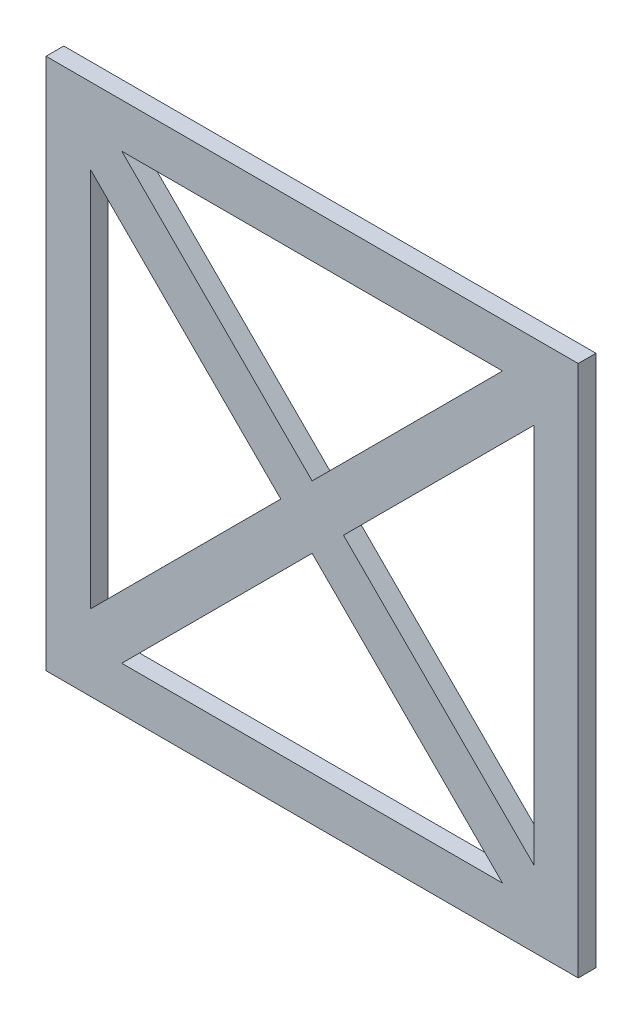
ISO-10303-21;
HEADER;
FILE_DESCRIPTION(('STEP AP214'),'2;1');
FILE_NAME('part.step','',(''),(''),'','','');
FILE_SCHEMA(('AUTOMOTIVE_DESIGN { 1 0 10303 214 1 1 1 1 }'));
ENDSEC;
DATA;
#1=APPLICATION_CONTEXT('core data for automotive mechanical design processes');
#2=APPLICATION_PROTOCOL_DEFINITION('international standard','automotive_design',2000,#1);
#3=PRODUCT_CONTEXT('',#1,'mechanical');
#4=PRODUCT('Part','Part','',(#3));
#5=PRODUCT_RELATED_PRODUCT_CATEGORY('part','',(#4));
#6=PRODUCT_DEFINITION_FORMATION('','',#4);
#7=PRODUCT_DEFINITION_CONTEXT('part definition',#1,'design');
#8=PRODUCT_DEFINITION('design','',#6,#7);
#9=PRODUCT_DEFINITION_SHAPE('','',#8);
#10=(LENGTH_UNIT() NAMED_UNIT(*) SI_UNIT(.MILLI.,.METRE.));
#11=(NAMED_UNIT(*) PLANE_ANGLE_UNIT() SI_UNIT($,.RADIAN.));
#12=(NAMED_UNIT(*) SI_UNIT($,.STERADIAN.) SOLID_ANGLE_UNIT());
#13=UNCERTAINTY_MEASURE_WITH_UNIT(LENGTH_MEASURE(1.E-05),#10,'distance_accuracy_value','');
#14=(GEOMETRIC_REPRESENTATION_CONTEXT(3) GLOBAL_UNCERTAINTY_ASSIGNED_CONTEXT((#13)) GLOBAL_UNIT_ASSIGNED_CONTEXT((#10,
#11,#12)) REPRESENTATION_CONTEXT('',''));
#15=CARTESIAN_POINT('',(0.,0.,0.));
#16=DIRECTION('',(0.,0.,1.));
#17=DIRECTION('',(1.,0.,0.));
#18=AXIS2_PLACEMENT_3D('',#15,#16,#17);
#19=CARTESIAN_POINT('',(0.,0.,10.));
#20=DIRECTION('',(0.,0.,-1.));
#21=DIRECTION('',(-1.,0.,0.));
#22=AXIS2_PLACEMENT_3D('',#19,#20,#21);
#23=PLANE('',#22);
#24=DIRECTION('',(-0.707106781186548,-0.707106781186548,0.));
#25=VECTOR('',#24,1.);
#26=CARTESIAN_POINT('',(125.,107.322330470336,10.));
#27=LINE('',#26,#25);
#28=CARTESIAN_POINT('',(125.,107.322330470336,10.));
#29=VERTEX_POINT('',#28);
#30=CARTESIAN_POINT('',(17.6776695296637,0.,10.));
#31=VERTEX_POINT('',#30);
#32=EDGE_CURVE('E173',#29,#31,#27,.T.);
#33=ORIENTED_EDGE('',*,*,#32,.F.);
#34=DIRECTION('',(0.,1.,0.));
#35=VECTOR('',#34,1.);
#36=CARTESIAN_POINT('',(125.,-107.322330470336,10.));
#37=LINE('',#36,#35);
#38=CARTESIAN_POINT('',(125.,-107.322330470336,10.));
#39=VERTEX_POINT('',#38);
#40=EDGE_CURVE('E179',#39,#29,#37,.T.);
#41=ORIENTED_EDGE('',*,*,#40,.F.);
#42=DIRECTION('',(0.707106781186548,-0.707106781186548,0.));
#43=VECTOR('',#42,1.);
#44=CARTESIAN_POINT('',(17.6776695296637,0.,10.));
#45=LINE('',#44,#43);
#46=EDGE_CURVE('E175',#31,#39,#45,.T.);
#47=ORIENTED_EDGE('',*,*,#46,.F.);
#48=EDGE_LOOP('',(#33,#41,#47));
#49=FACE_BOUND('',#48,.T.);
#50=DIRECTION('',(0.707106781186548,-0.707106781186548,0.));
#51=VECTOR('',#50,1.);
#52=CARTESIAN_POINT('',(-107.322330470336,125.,10.));
#53=LINE('',#52,#51);
#54=CARTESIAN_POINT('',(-107.322330470336,125.,10.));
#55=VERTEX_POINT('',#54);
#56=CARTESIAN_POINT('',(0.,17.6776695296637,10.));
#57=VERTEX_POINT('',#56);
#58=EDGE_CURVE('E221',#55,#57,#53,.T.);
#59=ORIENTED_EDGE('',*,*,#58,.F.);
#60=DIRECTION('',(-1.,0.,0.));
#61=VECTOR('',#60,1.);
#62=CARTESIAN_POINT('',(-107.322330470336,125.,10.));
#63=LINE('',#62,#61);
#64=CARTESIAN_POINT('',(107.322330470336,125.,10.));
#65=VERTEX_POINT('',#64);
#66=EDGE_CURVE('E227',#65,#55,#63,.T.);
#67=ORIENTED_EDGE('',*,*,#66,.F.);
#68=DIRECTION('',(0.707106781186548,0.707106781186547,0.));
#69=VECTOR('',#68,1.);
#70=CARTESIAN_POINT('',(107.322330470336,125.,10.));
#71=LINE('',#70,#69);
#72=EDGE_CURVE('E223',#57,#65,#71,.T.);
#73=ORIENTED_EDGE('',*,*,#72,.F.);
#74=EDGE_LOOP('',(#59,#67,#73));
#75=FACE_BOUND('',#74,.T.);
#76=DIRECTION('',(0.,1.,0.));
#77=VECTOR('',#76,1.);
#78=CARTESIAN_POINT('',(150.,-150.,10.));
#79=LINE('',#78,#77);
#80=CARTESIAN_POINT('',(150.,-150.,10.));
#81=VERTEX_POINT('',#80);
#82=CARTESIAN_POINT('',(150.,150.,10.));
#83=VERTEX_POINT('',#82);
#84=EDGE_CURVE('E245',#81,#83,#79,.T.);
#85=ORIENTED_EDGE('',*,*,#84,.T.);
#86=DIRECTION('',(-1.,0.,0.));
#87=VECTOR('',#86,1.);
#88=CARTESIAN_POINT('',(-150.,150.,10.));
#89=LINE('',#88,#87);
#90=CARTESIAN_POINT('',(-150.,150.,10.));
#91=VERTEX_POINT('',#90);
#92=EDGE_CURVE('E248',#83,#91,#89,.T.);
#93=ORIENTED_EDGE('',*,*,#92,.T.);
#94=DIRECTION('',(0.,-1.,0.));
#95=VECTOR('',#94,1.);
#96=CARTESIAN_POINT('',(-150.,-150.,10.));
#97=LINE('',#96,#95);
#98=CARTESIAN_POINT('',(-150.,-150.,10.));
#99=VERTEX_POINT('',#98);
#100=EDGE_CURVE('E251',#91,#99,#97,.T.);
#101=ORIENTED_EDGE('',*,*,#100,.T.);
#102=DIRECTION('',(1.,0.,0.));
#103=VECTOR('',#102,1.);
#104=CARTESIAN_POINT('',(-150.,-150.,10.));
#105=LINE('',#104,#103);
#106=EDGE_CURVE('E253',#99,#81,#105,.T.);
#107=ORIENTED_EDGE('',*,*,#106,.T.);
#108=EDGE_LOOP('',(#85,#93,#101,#107));
#109=FACE_BOUND('',#108,.T.);
#110=DIRECTION('',(-0.707106781186547,0.707106781186548,0.));
#111=VECTOR('',#110,1.);
#112=CARTESIAN_POINT('',(-125.,107.322330470336,10.));
#113=LINE('',#112,#111);
#114=CARTESIAN_POINT('',(-17.6776695296637,0.,10.));
#115=VERTEX_POINT('',#114);
#116=CARTESIAN_POINT('',(-125.,107.322330470336,10.));
#117=VERTEX_POINT('',#116);
#118=EDGE_CURVE('E197',#115,#117,#113,.T.);
#119=ORIENTED_EDGE('',*,*,#118,.F.);
#120=DIRECTION('',(0.707106781186548,0.707106781186547,0.));
#121=VECTOR('',#120,1.);
#122=CARTESIAN_POINT('',(-17.6776695296637,0.,10.));
#123=LINE('',#122,#121);
#124=CARTESIAN_POINT('',(-125.,-107.322330470336,10.));
#125=VERTEX_POINT('',#124);
#126=EDGE_CURVE('E203',#125,#115,#123,.T.);
#127=ORIENTED_EDGE('',*,*,#126,.F.);
#128=DIRECTION('',(0.,-1.,0.));
#129=VECTOR('',#128,1.);
#130=CARTESIAN_POINT('',(-125.,-107.322330470336,10.));
#131=LINE('',#130,#129);
#132=EDGE_CURVE('E199',#117,#125,#131,.T.);
#133=ORIENTED_EDGE('',*,*,#132,.F.);
#134=EDGE_LOOP('',(#119,#127,#133));
#135=FACE_BOUND('',#134,.T.);
#136=DIRECTION('',(-0.707106781186548,-0.707106781186547,0.));
#137=VECTOR('',#136,1.);
#138=CARTESIAN_POINT('',(0.,-17.6776695296637,10.));
#139=LINE('',#138,#137);
#140=CARTESIAN_POINT('',(0.,-17.6776695296637,10.));
#141=VERTEX_POINT('',#140);
#142=CARTESIAN_POINT('',(-107.322330470336,-125.,10.));
#143=VERTEX_POINT('',#142);
#144=EDGE_CURVE('E146',#141,#143,#139,.T.);
#145=ORIENTED_EDGE('',*,*,#144,.F.);
#146=DIRECTION('',(-0.707106781186548,0.707106781186548,0.));
#147=VECTOR('',#146,1.);
#148=CARTESIAN_POINT('',(0.,-17.6776695296637,10.));
#149=LINE('',#148,#147);
#150=CARTESIAN_POINT('',(107.322330470336,-125.,10.));
#151=VERTEX_POINT('',#150);
#152=EDGE_CURVE('E163',#151,#141,#149,.T.);
#153=ORIENTED_EDGE('',*,*,#152,.F.);
#154=DIRECTION('',(1.,0.,0.));
#155=VECTOR('',#154,1.);
#156=CARTESIAN_POINT('',(-107.322330470336,-125.,10.));
#157=LINE('',#156,#155);
#158=EDGE_CURVE('E154',#143,#151,#157,.T.);
#159=ORIENTED_EDGE('',*,*,#158,.F.);
#160=EDGE_LOOP('',(#145,#153,#159));
#161=FACE_BOUND('',#160,.T.);
#162=ADVANCED_FACE('F33',(#49,#75,#109,#135,#161),#23,.F.);
#163=CARTESIAN_POINT('',(0.,0.,0.));
#164=DIRECTION('',(0.,0.,-1.));
#165=DIRECTION('',(-1.,0.,0.));
#166=AXIS2_PLACEMENT_3D('',#163,#164,#165);
#167=PLANE('',#166);
#168=DIRECTION('',(0.,1.,0.));
#169=VECTOR('',#168,1.);
#170=CARTESIAN_POINT('',(150.,-150.,0.));
#171=LINE('',#170,#169);
#172=CARTESIAN_POINT('',(150.,-150.,0.));
#173=VERTEX_POINT('',#172);
#174=CARTESIAN_POINT('',(150.,150.,0.));
#175=VERTEX_POINT('',#174);
#176=EDGE_CURVE('E244',#173,#175,#171,.T.);
#177=ORIENTED_EDGE('',*,*,#176,.F.);
#178=DIRECTION('',(1.,0.,0.));
#179=VECTOR('',#178,1.);
#180=CARTESIAN_POINT('',(-150.,-150.,0.));
#181=LINE('',#180,#179);
#182=CARTESIAN_POINT('',(-150.,-150.,0.));
#183=VERTEX_POINT('',#182);
#184=EDGE_CURVE('E249',#183,#173,#181,.T.);
#185=ORIENTED_EDGE('',*,*,#184,.F.);
#186=DIRECTION('',(0.,-1.,0.));
#187=VECTOR('',#186,1.);
#188=CARTESIAN_POINT('',(-150.,-150.,0.));
#189=LINE('',#188,#187);
#190=CARTESIAN_POINT('',(-150.,150.,0.));
#191=VERTEX_POINT('',#190);
#192=EDGE_CURVE('E260',#191,#183,#189,.T.);
#193=ORIENTED_EDGE('',*,*,#192,.F.);
#194=DIRECTION('',(-1.,0.,0.));
#195=VECTOR('',#194,1.);
#196=CARTESIAN_POINT('',(-150.,150.,0.));
#197=LINE('',#196,#195);
#198=EDGE_CURVE('E258',#175,#191,#197,.T.);
#199=ORIENTED_EDGE('',*,*,#198,.F.);
#200=EDGE_LOOP('',(#177,#185,#193,#199));
#201=FACE_BOUND('',#200,.T.);
#202=DIRECTION('',(-1.,0.,0.));
#203=VECTOR('',#202,1.);
#204=CARTESIAN_POINT('',(-107.322330470336,125.,0.));
#205=LINE('',#204,#203);
#206=CARTESIAN_POINT('',(107.322330470336,125.,0.));
#207=VERTEX_POINT('',#206);
#208=CARTESIAN_POINT('',(-107.322330470336,125.,0.));
#209=VERTEX_POINT('',#208);
#210=EDGE_CURVE('E224',#207,#209,#205,.T.);
#211=ORIENTED_EDGE('',*,*,#210,.T.);
#212=DIRECTION('',(0.707106781186548,-0.707106781186548,0.));
#213=VECTOR('',#212,1.);
#214=CARTESIAN_POINT('',(-107.322330470336,125.,0.));
#215=LINE('',#214,#213);
#216=CARTESIAN_POINT('',(0.,17.6776695296637,0.));
#217=VERTEX_POINT('',#216);
#218=EDGE_CURVE('E220',#209,#217,#215,.T.);
#219=ORIENTED_EDGE('',*,*,#218,.T.);
#220=DIRECTION('',(0.707106781186548,0.707106781186547,0.));
#221=VECTOR('',#220,1.);
#222=CARTESIAN_POINT('',(107.322330470336,125.,0.));
#223=LINE('',#222,#221);
#224=EDGE_CURVE('E232',#217,#207,#223,.T.);
#225=ORIENTED_EDGE('',*,*,#224,.T.);
#226=EDGE_LOOP('',(#211,#219,#225));
#227=FACE_BOUND('',#226,.T.);
#228=DIRECTION('',(0.707106781186548,0.707106781186547,0.));
#229=VECTOR('',#228,1.);
#230=CARTESIAN_POINT('',(-17.6776695296637,0.,0.));
#231=LINE('',#230,#229);
#232=CARTESIAN_POINT('',(-125.,-107.322330470336,0.));
#233=VERTEX_POINT('',#232);
#234=CARTESIAN_POINT('',(-17.6776695296637,0.,0.));
#235=VERTEX_POINT('',#234);
#236=EDGE_CURVE('E200',#233,#235,#231,.T.);
#237=ORIENTED_EDGE('',*,*,#236,.T.);
#238=DIRECTION('',(-0.707106781186547,0.707106781186548,0.));
#239=VECTOR('',#238,1.);
#240=CARTESIAN_POINT('',(-125.,107.322330470336,0.));
#241=LINE('',#240,#239);
#242=CARTESIAN_POINT('',(-125.,107.322330470336,0.));
#243=VERTEX_POINT('',#242);
#244=EDGE_CURVE('E196',#235,#243,#241,.T.);
#245=ORIENTED_EDGE('',*,*,#244,.T.);
#246=DIRECTION('',(0.,-1.,0.));
#247=VECTOR('',#246,1.);
#248=CARTESIAN_POINT('',(-125.,-107.322330470336,0.));
#249=LINE('',#248,#247);
#250=EDGE_CURVE('E208',#243,#233,#249,.T.);
#251=ORIENTED_EDGE('',*,*,#250,.T.);
#252=EDGE_LOOP('',(#237,#245,#251));
#253=FACE_BOUND('',#252,.T.);
#254=DIRECTION('',(0.,1.,0.));
#255=VECTOR('',#254,1.);
#256=CARTESIAN_POINT('',(125.,-107.322330470336,0.));
#257=LINE('',#256,#255);
#258=CARTESIAN_POINT('',(125.,-107.322330470336,0.));
#259=VERTEX_POINT('',#258);
#260=CARTESIAN_POINT('',(125.,107.322330470336,0.));
#261=VERTEX_POINT('',#260);
#262=EDGE_CURVE('E176',#259,#261,#257,.T.);
#263=ORIENTED_EDGE('',*,*,#262,.T.);
#264=DIRECTION('',(-0.707106781186548,-0.707106781186548,0.));
#265=VECTOR('',#264,1.);
#266=CARTESIAN_POINT('',(125.,107.322330470336,0.));
#267=LINE('',#266,#265);
#268=CARTESIAN_POINT('',(17.6776695296637,0.,0.));
#269=VERTEX_POINT('',#268);
#270=EDGE_CURVE('E161',#261,#269,#267,.T.);
#271=ORIENTED_EDGE('',*,*,#270,.T.);
#272=DIRECTION('',(0.707106781186548,-0.707106781186548,0.));
#273=VECTOR('',#272,1.);
#274=CARTESIAN_POINT('',(17.6776695296637,0.,0.));
#275=LINE('',#274,#273);
#276=EDGE_CURVE('E184',#269,#259,#275,.T.);
#277=ORIENTED_EDGE('',*,*,#276,.T.);
#278=EDGE_LOOP('',(#263,#271,#277));
#279=FACE_BOUND('',#278,.T.);
#280=DIRECTION('',(-0.707106781186548,0.707106781186548,0.));
#281=VECTOR('',#280,1.);
#282=CARTESIAN_POINT('',(0.,-17.6776695296637,0.));
#283=LINE('',#282,#281);
#284=CARTESIAN_POINT('',(107.322330470336,-125.,0.));
#285=VERTEX_POINT('',#284);
#286=CARTESIAN_POINT('',(0.,-17.6776695296637,0.));
#287=VERTEX_POINT('',#286);
#288=EDGE_CURVE('E155',#285,#287,#283,.T.);
#289=ORIENTED_EDGE('',*,*,#288,.T.);
#290=DIRECTION('',(-0.707106781186548,-0.707106781186547,0.));
#291=VECTOR('',#290,1.);
#292=CARTESIAN_POINT('',(0.,-17.6776695296637,0.));
#293=LINE('',#292,#291);
#294=CARTESIAN_POINT('',(-107.322330470336,-125.,0.));
#295=VERTEX_POINT('',#294);
#296=EDGE_CURVE('E56',#287,#295,#293,.T.);
#297=ORIENTED_EDGE('',*,*,#296,.T.);
#298=DIRECTION('',(1.,0.,0.));
#299=VECTOR('',#298,1.);
#300=CARTESIAN_POINT('',(-107.322330470336,-125.,0.));
#301=LINE('',#300,#299);
#302=EDGE_CURVE('E160',#295,#285,#301,.T.);
#303=ORIENTED_EDGE('',*,*,#302,.T.);
#304=EDGE_LOOP('',(#289,#297,#303));
#305=FACE_BOUND('',#304,.T.);
#306=ADVANCED_FACE('F278',(#201,#227,#253,#279,#305),#167,.T.);
#307=CARTESIAN_POINT('',(150.,-150.,10.));
#308=DIRECTION('',(-1.,0.,0.));
#309=DIRECTION('',(0.,0.,1.));
#310=AXIS2_PLACEMENT_3D('',#307,#308,#309);
#311=PLANE('',#310);
#312=ORIENTED_EDGE('',*,*,#176,.T.);
#313=DIRECTION('',(0.,0.,-1.));
#314=VECTOR('',#313,1.);
#315=CARTESIAN_POINT('',(150.,150.,10.));
#316=LINE('',#315,#314);
#317=EDGE_CURVE('E11',#83,#175,#316,.T.);
#318=ORIENTED_EDGE('',*,*,#317,.F.);
#319=ORIENTED_EDGE('',*,*,#84,.F.);
#320=DIRECTION('',(0.,0.,-1.));
#321=VECTOR('',#320,1.);
#322=CARTESIAN_POINT('',(150.,-150.,10.));
#323=LINE('',#322,#321);
#324=EDGE_CURVE('E255',#81,#173,#323,.T.);
#325=ORIENTED_EDGE('',*,*,#324,.T.);
#326=EDGE_LOOP('',(#312,#318,#319,#325));
#327=FACE_BOUND('',#326,.T.);
#328=ADVANCED_FACE('F35',(#327),#311,.F.);
#329=CARTESIAN_POINT('',(-150.,150.,10.));
#330=DIRECTION('',(0.,-1.,0.));
#331=DIRECTION('',(0.,0.,-1.));
#332=AXIS2_PLACEMENT_3D('',#329,#330,#331);
#333=PLANE('',#332);
#334=ORIENTED_EDGE('',*,*,#198,.T.);
#335=DIRECTION('',(0.,0.,-1.));
#336=VECTOR('',#335,1.);
#337=CARTESIAN_POINT('',(-150.,150.,10.));
#338=LINE('',#337,#336);
#339=EDGE_CURVE('E41',#91,#191,#338,.T.);
#340=ORIENTED_EDGE('',*,*,#339,.F.);
#341=ORIENTED_EDGE('',*,*,#92,.F.);
#342=ORIENTED_EDGE('',*,*,#317,.T.);
#343=EDGE_LOOP('',(#334,#340,#341,#342));
#344=FACE_BOUND('',#343,.T.);
#345=ADVANCED_FACE('F289',(#344),#333,.F.);
#346=CARTESIAN_POINT('',(-150.,-150.,10.));
#347=DIRECTION('',(1.,0.,0.));
#348=DIRECTION('',(0.,0.,-1.));
#349=AXIS2_PLACEMENT_3D('',#346,#347,#348);
#350=PLANE('',#349);
#351=ORIENTED_EDGE('',*,*,#192,.T.);
#352=DIRECTION('',(0.,0.,-1.));
#353=VECTOR('',#352,1.);
#354=CARTESIAN_POINT('',(-150.,-150.,10.));
#355=LINE('',#354,#353);
#356=EDGE_CURVE('E265',#99,#183,#355,.T.);
#357=ORIENTED_EDGE('',*,*,#356,.F.);
#358=ORIENTED_EDGE('',*,*,#100,.F.);
#359=ORIENTED_EDGE('',*,*,#339,.T.);
#360=EDGE_LOOP('',(#351,#357,#358,#359));
#361=FACE_BOUND('',#360,.T.);
#362=ADVANCED_FACE('F272',(#361),#350,.F.);
#363=CARTESIAN_POINT('',(-150.,-150.,10.));
#364=DIRECTION('',(0.,1.,0.));
#365=DIRECTION('',(0.,0.,1.));
#366=AXIS2_PLACEMENT_3D('',#363,#364,#365);
#367=PLANE('',#366);
#368=ORIENTED_EDGE('',*,*,#184,.T.);
#369=ORIENTED_EDGE('',*,*,#324,.F.);
#370=ORIENTED_EDGE('',*,*,#106,.F.);
#371=ORIENTED_EDGE('',*,*,#356,.T.);
#372=EDGE_LOOP('',(#368,#369,#370,#371));
#373=FACE_BOUND('',#372,.T.);
#374=ADVANCED_FACE('F282',(#373),#367,.F.);
#375=CARTESIAN_POINT('',(-107.322330470336,125.,10.));
#376=DIRECTION('',(0.707106781186548,0.707106781186548,0.));
#377=DIRECTION('',(-0.707106781186548,0.707106781186548,0.));
#378=AXIS2_PLACEMENT_3D('',#375,#376,#377);
#379=PLANE('',#378);
#380=ORIENTED_EDGE('',*,*,#218,.F.);
#381=DIRECTION('',(0.,0.,-1.));
#382=VECTOR('',#381,1.);
#383=CARTESIAN_POINT('',(-107.322330470336,125.,10.));
#384=LINE('',#383,#382);
#385=EDGE_CURVE('E229',#55,#209,#384,.T.);
#386=ORIENTED_EDGE('',*,*,#385,.F.);
#387=ORIENTED_EDGE('',*,*,#58,.T.);
#388=DIRECTION('',(0.,0.,-1.));
#389=VECTOR('',#388,1.);
#390=CARTESIAN_POINT('',(0.,17.6776695296637,10.));
#391=LINE('',#390,#389);
#392=EDGE_CURVE('E241',#57,#217,#391,.T.);
#393=ORIENTED_EDGE('',*,*,#392,.T.);
#394=EDGE_LOOP('',(#380,#386,#387,#393));
#395=FACE_BOUND('',#394,.T.);
#396=ADVANCED_FACE('F306',(#395),#379,.T.);
#397=CARTESIAN_POINT('',(107.322330470336,125.,10.));
#398=DIRECTION('',(-0.707106781186547,0.707106781186548,0.));
#399=DIRECTION('',(-0.707106781186548,-0.707106781186547,0.));
#400=AXIS2_PLACEMENT_3D('',#397,#398,#399);
#401=PLANE('',#400);
#402=ORIENTED_EDGE('',*,*,#224,.F.);
#403=ORIENTED_EDGE('',*,*,#392,.F.);
#404=ORIENTED_EDGE('',*,*,#72,.T.);
#405=DIRECTION('',(0.,0.,-1.));
#406=VECTOR('',#405,1.);
#407=CARTESIAN_POINT('',(107.322330470336,125.,10.));
#408=LINE('',#407,#406);
#409=EDGE_CURVE('E239',#65,#207,#408,.T.);
#410=ORIENTED_EDGE('',*,*,#409,.T.);
#411=EDGE_LOOP('',(#402,#403,#404,#410));
#412=FACE_BOUND('',#411,.T.);
#413=ADVANCED_FACE('F313',(#412),#401,.T.);
#414=CARTESIAN_POINT('',(-107.322330470336,125.,10.));
#415=DIRECTION('',(0.,-1.,0.));
#416=DIRECTION('',(1.,0.,0.));
#417=AXIS2_PLACEMENT_3D('',#414,#415,#416);
#418=PLANE('',#417);
#419=ORIENTED_EDGE('',*,*,#210,.F.);
#420=ORIENTED_EDGE('',*,*,#409,.F.);
#421=ORIENTED_EDGE('',*,*,#66,.T.);
#422=ORIENTED_EDGE('',*,*,#385,.T.);
#423=EDGE_LOOP('',(#419,#420,#421,#422));
#424=FACE_BOUND('',#423,.T.);
#425=ADVANCED_FACE('F318',(#424),#418,.T.);
#426=CARTESIAN_POINT('',(-125.,107.322330470336,10.));
#427=DIRECTION('',(-0.707106781186548,-0.707106781186547,0.));
#428=DIRECTION('',(0.707106781186547,-0.707106781186548,0.));
#429=AXIS2_PLACEMENT_3D('',#426,#427,#428);
#430=PLANE('',#429);
#431=ORIENTED_EDGE('',*,*,#244,.F.);
#432=DIRECTION('',(0.,0.,-1.));
#433=VECTOR('',#432,1.);
#434=CARTESIAN_POINT('',(-17.6776695296637,0.,10.));
#435=LINE('',#434,#433);
#436=EDGE_CURVE('E205',#115,#235,#435,.T.);
#437=ORIENTED_EDGE('',*,*,#436,.F.);
#438=ORIENTED_EDGE('',*,*,#118,.T.);
#439=DIRECTION('',(0.,0.,-1.));
#440=VECTOR('',#439,1.);
#441=CARTESIAN_POINT('',(-125.,107.322330470336,10.));
#442=LINE('',#441,#440);
#443=EDGE_CURVE('E217',#117,#243,#442,.T.);
#444=ORIENTED_EDGE('',*,*,#443,.T.);
#445=EDGE_LOOP('',(#431,#437,#438,#444));
#446=FACE_BOUND('',#445,.T.);
#447=ADVANCED_FACE('F361',(#446),#430,.T.);
#448=CARTESIAN_POINT('',(-125.,-107.322330470336,10.));
#449=DIRECTION('',(1.,0.,0.));
#450=DIRECTION('',(0.,1.,0.));
#451=AXIS2_PLACEMENT_3D('',#448,#449,#450);
#452=PLANE('',#451);
#453=ORIENTED_EDGE('',*,*,#250,.F.);
#454=ORIENTED_EDGE('',*,*,#443,.F.);
#455=ORIENTED_EDGE('',*,*,#132,.T.);
#456=DIRECTION('',(0.,0.,-1.));
#457=VECTOR('',#456,1.);
#458=CARTESIAN_POINT('',(-125.,-107.322330470336,10.));
#459=LINE('',#458,#457);
#460=EDGE_CURVE('E215',#125,#233,#459,.T.);
#461=ORIENTED_EDGE('',*,*,#460,.T.);
#462=EDGE_LOOP('',(#453,#454,#455,#461));
#463=FACE_BOUND('',#462,.T.);
#464=ADVANCED_FACE('F357',(#463),#452,.T.);
#465=CARTESIAN_POINT('',(-17.6776695296637,0.,10.));
#466=DIRECTION('',(-0.707106781186547,0.707106781186548,0.));
#467=DIRECTION('',(-0.707106781186548,-0.707106781186547,0.));
#468=AXIS2_PLACEMENT_3D('',#465,#466,#467);
#469=PLANE('',#468);
#470=ORIENTED_EDGE('',*,*,#236,.F.);
#471=ORIENTED_EDGE('',*,*,#460,.F.);
#472=ORIENTED_EDGE('',*,*,#126,.T.);
#473=ORIENTED_EDGE('',*,*,#436,.T.);
#474=EDGE_LOOP('',(#470,#471,#472,#473));
#475=FACE_BOUND('',#474,.T.);
#476=ADVANCED_FACE('F353',(#475),#469,.T.);
#477=CARTESIAN_POINT('',(125.,107.322330470336,10.));
#478=DIRECTION('',(0.707106781186548,-0.707106781186548,0.));
#479=DIRECTION('',(0.707106781186548,0.707106781186548,0.));
#480=AXIS2_PLACEMENT_3D('',#477,#478,#479);
#481=PLANE('',#480);
#482=ORIENTED_EDGE('',*,*,#270,.F.);
#483=DIRECTION('',(0.,0.,-1.));
#484=VECTOR('',#483,1.);
#485=CARTESIAN_POINT('',(125.,107.322330470336,10.));
#486=LINE('',#485,#484);
#487=EDGE_CURVE('E181',#29,#261,#486,.T.);
#488=ORIENTED_EDGE('',*,*,#487,.F.);
#489=ORIENTED_EDGE('',*,*,#32,.T.);
#490=DIRECTION('',(0.,0.,-1.));
#491=VECTOR('',#490,1.);
#492=CARTESIAN_POINT('',(17.6776695296637,0.,10.));
#493=LINE('',#492,#491);
#494=EDGE_CURVE('E193',#31,#269,#493,.T.);
#495=ORIENTED_EDGE('',*,*,#494,.T.);
#496=EDGE_LOOP('',(#482,#488,#489,#495));
#497=FACE_BOUND('',#496,.T.);
#498=ADVANCED_FACE('F349',(#497),#481,.T.);
#499=CARTESIAN_POINT('',(17.6776695296637,0.,10.));
#500=DIRECTION('',(0.707106781186548,0.707106781186548,0.));
#501=DIRECTION('',(-0.707106781186548,0.707106781186548,0.));
#502=AXIS2_PLACEMENT_3D('',#499,#500,#501);
#503=PLANE('',#502);
#504=ORIENTED_EDGE('',*,*,#276,.F.);
#505=ORIENTED_EDGE('',*,*,#494,.F.);
#506=ORIENTED_EDGE('',*,*,#46,.T.);
#507=DIRECTION('',(0.,0.,-1.));
#508=VECTOR('',#507,1.);
#509=CARTESIAN_POINT('',(125.,-107.322330470336,10.));
#510=LINE('',#509,#508);
#511=EDGE_CURVE('E191',#39,#259,#510,.T.);
#512=ORIENTED_EDGE('',*,*,#511,.T.);
#513=EDGE_LOOP('',(#504,#505,#506,#512));
#514=FACE_BOUND('',#513,.T.);
#515=ADVANCED_FACE('F345',(#514),#503,.T.);
#516=CARTESIAN_POINT('',(125.,-107.322330470336,10.));
#517=DIRECTION('',(-1.,0.,0.));
#518=DIRECTION('',(0.,-1.,0.));
#519=AXIS2_PLACEMENT_3D('',#516,#517,#518);
#520=PLANE('',#519);
#521=ORIENTED_EDGE('',*,*,#262,.F.);
#522=ORIENTED_EDGE('',*,*,#511,.F.);
#523=ORIENTED_EDGE('',*,*,#40,.T.);
#524=ORIENTED_EDGE('',*,*,#487,.T.);
#525=EDGE_LOOP('',(#521,#522,#523,#524));
#526=FACE_BOUND('',#525,.T.);
#527=ADVANCED_FACE('F342',(#526),#520,.T.);
#528=CARTESIAN_POINT('',(0.,-17.6776695296637,10.));
#529=DIRECTION('',(0.707106781186547,-0.707106781186548,0.));
#530=DIRECTION('',(0.707106781186548,0.707106781186547,0.));
#531=AXIS2_PLACEMENT_3D('',#528,#529,#530);
#532=PLANE('',#531);
#533=ORIENTED_EDGE('',*,*,#296,.F.);
#534=DIRECTION('',(0.,0.,-1.));
#535=VECTOR('',#534,1.);
#536=CARTESIAN_POINT('',(0.,-17.6776695296637,10.));
#537=LINE('',#536,#535);
#538=EDGE_CURVE('E150',#141,#287,#537,.T.);
#539=ORIENTED_EDGE('',*,*,#538,.F.);
#540=ORIENTED_EDGE('',*,*,#144,.T.);
#541=DIRECTION('',(0.,0.,-1.));
#542=VECTOR('',#541,1.);
#543=CARTESIAN_POINT('',(-107.322330470336,-125.,10.));
#544=LINE('',#543,#542);
#545=EDGE_CURVE('E149',#143,#295,#544,.T.);
#546=ORIENTED_EDGE('',*,*,#545,.T.);
#547=EDGE_LOOP('',(#533,#539,#540,#546));
#548=FACE_BOUND('',#547,.T.);
#549=ADVANCED_FACE('F148',(#548),#532,.T.);
#550=CARTESIAN_POINT('',(-107.322330470336,-125.,10.));
#551=DIRECTION('',(0.,1.,0.));
#552=DIRECTION('',(-1.,0.,0.));
#553=AXIS2_PLACEMENT_3D('',#550,#551,#552);
#554=PLANE('',#553);
#555=ORIENTED_EDGE('',*,*,#302,.F.);
#556=ORIENTED_EDGE('',*,*,#545,.F.);
#557=ORIENTED_EDGE('',*,*,#158,.T.);
#558=DIRECTION('',(0.,0.,-1.));
#559=VECTOR('',#558,1.);
#560=CARTESIAN_POINT('',(107.322330470336,-125.,10.));
#561=LINE('',#560,#559);
#562=EDGE_CURVE('E48',#151,#285,#561,.T.);
#563=ORIENTED_EDGE('',*,*,#562,.T.);
#564=EDGE_LOOP('',(#555,#556,#557,#563));
#565=FACE_BOUND('',#564,.T.);
#566=ADVANCED_FACE('F158',(#565),#554,.T.);
#567=CARTESIAN_POINT('',(0.,-17.6776695296637,10.));
#568=DIRECTION('',(-0.707106781186548,-0.707106781186548,0.));
#569=DIRECTION('',(0.707106781186548,-0.707106781186548,0.));
#570=AXIS2_PLACEMENT_3D('',#567,#568,#569);
#571=PLANE('',#570);
#572=ORIENTED_EDGE('',*,*,#288,.F.);
#573=ORIENTED_EDGE('',*,*,#562,.F.);
#574=ORIENTED_EDGE('',*,*,#152,.T.);
#575=ORIENTED_EDGE('',*,*,#538,.T.);
#576=EDGE_LOOP('',(#572,#573,#574,#575));
#577=FACE_BOUND('',#576,.T.);
#578=ADVANCED_FACE('F332',(#577),#571,.T.);
#579=CLOSED_SHELL('',(#162,#306,#328,#345,#362,#374,#396,#413,#425,#447,#464,#476,#498,#515,
#527,#549,#566,#578));
#580=MANIFOLD_SOLID_BREP('B2',#579);
#581=ADVANCED_BREP_SHAPE_REPRESENTATION('',(#18,#580),#14);
#582=SHAPE_DEFINITION_REPRESENTATION(#9,#581);
ENDSEC;
END-ISO-10303-21;
